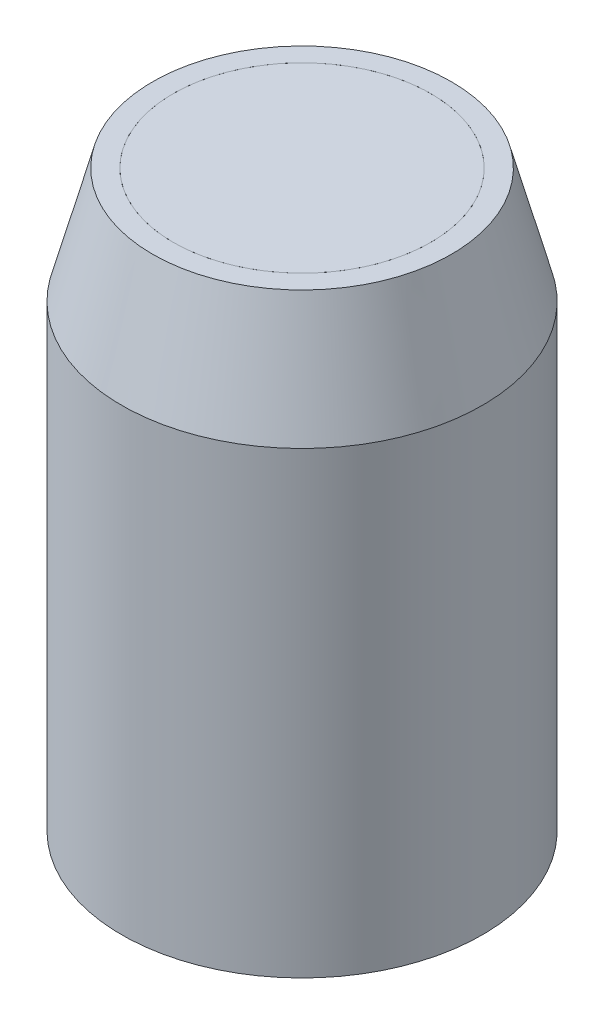
ISO-10303-21;
HEADER;
FILE_DESCRIPTION(('STEP AP214'),'2;1');
FILE_NAME('part.step','',(''),(''),'','','');
FILE_SCHEMA(('AUTOMOTIVE_DESIGN { 1 0 10303 214 1 1 1 1 }'));
ENDSEC;
DATA;
#1=APPLICATION_CONTEXT('core data for automotive mechanical design processes');
#2=APPLICATION_PROTOCOL_DEFINITION('international standard','automotive_design',2000,#1);
#3=PRODUCT_CONTEXT('',#1,'mechanical');
#4=PRODUCT('Part','Part','',(#3));
#5=PRODUCT_RELATED_PRODUCT_CATEGORY('part','',(#4));
#6=PRODUCT_DEFINITION_FORMATION('','',#4);
#7=PRODUCT_DEFINITION_CONTEXT('part definition',#1,'design');
#8=PRODUCT_DEFINITION('design','',#6,#7);
#9=PRODUCT_DEFINITION_SHAPE('','',#8);
#10=(LENGTH_UNIT() NAMED_UNIT(*) SI_UNIT(.MILLI.,.METRE.));
#11=(NAMED_UNIT(*) PLANE_ANGLE_UNIT() SI_UNIT($,.RADIAN.));
#12=(NAMED_UNIT(*) SI_UNIT($,.STERADIAN.) SOLID_ANGLE_UNIT());
#13=UNCERTAINTY_MEASURE_WITH_UNIT(LENGTH_MEASURE(1.E-05),#10,'distance_accuracy_value','');
#14=(GEOMETRIC_REPRESENTATION_CONTEXT(3) GLOBAL_UNCERTAINTY_ASSIGNED_CONTEXT((#13)) GLOBAL_UNIT_ASSIGNED_CONTEXT((#10,
#11,#12)) REPRESENTATION_CONTEXT('',''));
#15=CARTESIAN_POINT('',(0.,0.,0.));
#16=DIRECTION('',(0.,0.,1.));
#17=DIRECTION('',(1.,0.,0.));
#18=AXIS2_PLACEMENT_3D('',#15,#16,#17);
#19=CARTESIAN_POINT('',(0.,0.,0.));
#20=DIRECTION('',(0.,-1.,0.));
#21=DIRECTION('',(0.,0.,-1.));
#22=AXIS2_PLACEMENT_3D('',#19,#20,#21);
#23=PLANE('',#22);
#24=CARTESIAN_POINT('',(0.,0.,0.));
#25=DIRECTION('',(0.,-1.,0.));
#26=DIRECTION('',(0.,0.,-1.));
#27=AXIS2_PLACEMENT_3D('',#24,#25,#26);
#28=CIRCLE('',#27,5.);
#29=CARTESIAN_POINT('',(0.,0.,-5.));
#30=VERTEX_POINT('',#29);
#31=EDGE_CURVE('E11',#30,#30,#28,.T.);
#32=ORIENTED_EDGE('',*,*,#31,.F.);
#33=EDGE_LOOP('',(#32));
#34=FACE_BOUND('',#33,.T.);
#35=ADVANCED_FACE('F47',(#34),#23,.F.);
#36=CARTESIAN_POINT('',(0.,0.,0.));
#37=DIRECTION('',(0.,-1.,0.));
#38=DIRECTION('',(0.,0.,-1.));
#39=AXIS2_PLACEMENT_3D('',#36,#37,#38);
#40=CYLINDRICAL_SURFACE('',#39,5.);
#41=CARTESIAN_POINT('',(0.,19.8744933930938,0.));
#42=DIRECTION('',(0.,-1.,0.));
#43=DIRECTION('',(0.,0.,-1.));
#44=AXIS2_PLACEMENT_3D('',#41,#42,#43);
#45=CIRCLE('',#44,5.);
#46=CARTESIAN_POINT('',(0.,19.8744933930938,-5.));
#47=VERTEX_POINT('',#46);
#48=EDGE_CURVE('E53',#47,#47,#45,.T.);
#49=ORIENTED_EDGE('',*,*,#48,.F.);
#50=EDGE_LOOP('',(#49));
#51=FACE_BOUND('',#50,.T.);
#52=ORIENTED_EDGE('',*,*,#31,.T.);
#53=EDGE_LOOP('',(#52));
#54=FACE_BOUND('',#53,.T.);
#55=ADVANCED_FACE('F86',(#51,#54),#40,.F.);
#56=CARTESIAN_POINT('',(-5.,19.8744933930938,0.));
#57=DIRECTION('',(0.,-1.,0.));
#58=DIRECTION('',(0.,0.,-1.));
#59=AXIS2_PLACEMENT_3D('',#56,#57,#58);
#60=PLANE('',#59);
#61=CARTESIAN_POINT('',(0.,19.8744933930938,0.));
#62=DIRECTION('',(0.,-1.,0.));
#63=DIRECTION('',(0.,0.,-1.));
#64=AXIS2_PLACEMENT_3D('',#61,#62,#63);
#65=CIRCLE('',#64,5.8);
#66=CARTESIAN_POINT('',(0.,19.8744933930938,-5.8));
#67=VERTEX_POINT('',#66);
#68=EDGE_CURVE('E57',#67,#67,#65,.T.);
#69=ORIENTED_EDGE('',*,*,#68,.F.);
#70=EDGE_LOOP('',(#69));
#71=FACE_BOUND('',#70,.T.);
#72=ORIENTED_EDGE('',*,*,#48,.T.);
#73=EDGE_LOOP('',(#72));
#74=FACE_BOUND('',#73,.T.);
#75=ADVANCED_FACE('F81',(#71,#74),#60,.F.);
#76=CARTESIAN_POINT('',(0.,19.8744933930938,0.));
#77=DIRECTION('',(0.,-1.,0.));
#78=DIRECTION('',(0.,0.,-1.));
#79=AXIS2_PLACEMENT_3D('',#76,#77,#78);
#80=CONICAL_SURFACE('',#79,5.8,0.26179938779915);
#81=CARTESIAN_POINT('',(0.,15.3960324240112,0.));
#82=DIRECTION('',(0.,-1.,0.));
#83=DIRECTION('',(0.,0.,-1.));
#84=AXIS2_PLACEMENT_3D('',#81,#82,#83);
#85=CIRCLE('',#84,7.);
#86=CARTESIAN_POINT('',(0.,15.3960324240112,-7.));
#87=VERTEX_POINT('',#86);
#88=EDGE_CURVE('E61',#87,#87,#85,.T.);
#89=ORIENTED_EDGE('',*,*,#88,.F.);
#90=EDGE_LOOP('',(#89));
#91=FACE_BOUND('',#90,.T.);
#92=ORIENTED_EDGE('',*,*,#68,.T.);
#93=EDGE_LOOP('',(#92));
#94=FACE_BOUND('',#93,.T.);
#95=ADVANCED_FACE('F75',(#91,#94),#80,.T.);
#96=CARTESIAN_POINT('',(0.,0.,0.));
#97=DIRECTION('',(0.,-1.,0.));
#98=DIRECTION('',(0.,0.,-1.));
#99=AXIS2_PLACEMENT_3D('',#96,#97,#98);
#100=CYLINDRICAL_SURFACE('',#99,7.);
#101=CARTESIAN_POINT('',(0.,-2.4,0.));
#102=DIRECTION('',(0.,-1.,0.));
#103=DIRECTION('',(0.,0.,-1.));
#104=AXIS2_PLACEMENT_3D('',#101,#102,#103);
#105=CIRCLE('',#104,7.);
#106=CARTESIAN_POINT('',(0.,-2.4,-7.));
#107=VERTEX_POINT('',#106);
#108=EDGE_CURVE('E66',#107,#107,#105,.T.);
#109=ORIENTED_EDGE('',*,*,#108,.F.);
#110=EDGE_LOOP('',(#109));
#111=FACE_BOUND('',#110,.T.);
#112=ORIENTED_EDGE('',*,*,#88,.T.);
#113=EDGE_LOOP('',(#112));
#114=FACE_BOUND('',#113,.T.);
#115=ADVANCED_FACE('F72',(#111,#114),#100,.T.);
#116=CARTESIAN_POINT('',(-7.,-2.4,0.));
#117=DIRECTION('',(0.,1.,0.));
#118=DIRECTION('',(0.,0.,1.));
#119=AXIS2_PLACEMENT_3D('',#116,#117,#118);
#120=PLANE('',#119);
#121=ORIENTED_EDGE('',*,*,#108,.T.);
#122=EDGE_LOOP('',(#121));
#123=FACE_BOUND('',#122,.T.);
#124=ADVANCED_FACE('F70',(#123),#120,.F.);
#125=CLOSED_SHELL('',(#35,#55,#75,#95,#115,#124));
#126=MANIFOLD_SOLID_BREP('B2',#125);
#127=CARTESIAN_POINT('',(0.,19.8744933930938,0.));
#128=DIRECTION('',(0.,-1.,0.));
#129=DIRECTION('',(0.,0.,-1.));
#130=AXIS2_PLACEMENT_3D('',#127,#128,#129);
#131=CYLINDRICAL_SURFACE('',#130,5.);
#132=CARTESIAN_POINT('',(0.,19.8744933930938,0.));
#133=DIRECTION('',(0.,1.,0.));
#134=DIRECTION('',(0.,0.,1.));
#135=AXIS2_PLACEMENT_3D('',#132,#133,#134);
#136=CIRCLE('',#135,5.);
#137=CARTESIAN_POINT('',(0.,19.8744933930938,5.));
#138=VERTEX_POINT('',#137);
#139=EDGE_CURVE('E46',#138,#138,#136,.T.);
#140=ORIENTED_EDGE('',*,*,#139,.F.);
#141=EDGE_LOOP('',(#140));
#142=FACE_BOUND('',#141,.T.);
#143=CARTESIAN_POINT('',(0.,0.,0.));
#144=DIRECTION('',(0.,1.,0.));
#145=DIRECTION('',(0.,0.,1.));
#146=AXIS2_PLACEMENT_3D('',#143,#144,#145);
#147=CIRCLE('',#146,5.);
#148=CARTESIAN_POINT('',(0.,0.,5.));
#149=VERTEX_POINT('',#148);
#150=EDGE_CURVE('E160',#149,#149,#147,.T.);
#151=ORIENTED_EDGE('',*,*,#150,.T.);
#152=EDGE_LOOP('',(#151));
#153=FACE_BOUND('',#152,.T.);
#154=ADVANCED_FACE('F157',(#142,#153),#131,.T.);
#155=CARTESIAN_POINT('',(0.,19.8744933930938,0.));
#156=DIRECTION('',(0.,1.,0.));
#157=DIRECTION('',(0.,0.,1.));
#158=AXIS2_PLACEMENT_3D('',#155,#156,#157);
#159=PLANE('',#158);
#160=ORIENTED_EDGE('',*,*,#139,.T.);
#161=EDGE_LOOP('',(#160));
#162=FACE_BOUND('',#161,.T.);
#163=ADVANCED_FACE('F172',(#162),#159,.T.);
#164=CARTESIAN_POINT('',(0.,0.,0.));
#165=DIRECTION('',(0.,1.,0.));
#166=DIRECTION('',(0.,0.,1.));
#167=AXIS2_PLACEMENT_3D('',#164,#165,#166);
#168=PLANE('',#167);
#169=ORIENTED_EDGE('',*,*,#150,.F.);
#170=EDGE_LOOP('',(#169));
#171=FACE_BOUND('',#170,.T.);
#172=ADVANCED_FACE('F170',(#171),#168,.F.);
#173=CLOSED_SHELL('',(#154,#163,#172));
#174=MANIFOLD_SOLID_BREP('B6_NOT_SHOWN',#173);
#175=ADVANCED_BREP_SHAPE_REPRESENTATION('',(#18,#126,#174),#14);
#176=SHAPE_DEFINITION_REPRESENTATION(#9,#175);
ENDSEC;
END-ISO-10303-21;
